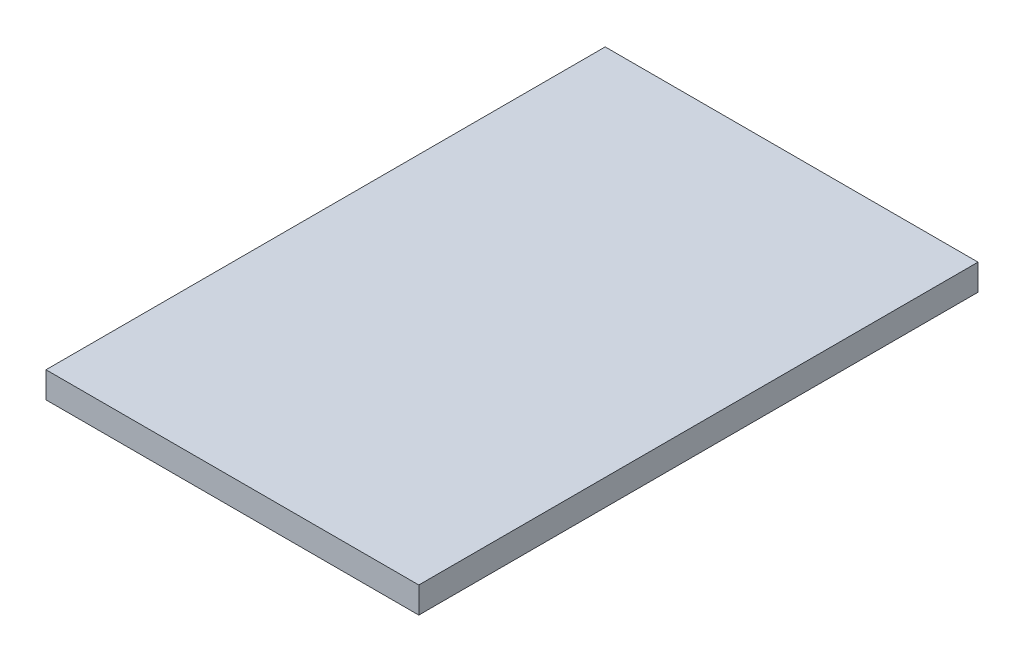
ISO-10303-21;
HEADER;
FILE_DESCRIPTION(('STEP AP214'),'2;1');
FILE_NAME('part.step','',(''),(''),'','','');
FILE_SCHEMA(('AUTOMOTIVE_DESIGN { 1 0 10303 214 1 1 1 1 }'));
ENDSEC;
DATA;
#1=APPLICATION_CONTEXT('core data for automotive mechanical design processes');
#2=APPLICATION_PROTOCOL_DEFINITION('international standard','automotive_design',2000,#1);
#3=PRODUCT_CONTEXT('',#1,'mechanical');
#4=PRODUCT('Part','Part','',(#3));
#5=PRODUCT_RELATED_PRODUCT_CATEGORY('part','',(#4));
#6=PRODUCT_DEFINITION_FORMATION('','',#4);
#7=PRODUCT_DEFINITION_CONTEXT('part definition',#1,'design');
#8=PRODUCT_DEFINITION('design','',#6,#7);
#9=PRODUCT_DEFINITION_SHAPE('','',#8);
#10=(LENGTH_UNIT() NAMED_UNIT(*) SI_UNIT(.MILLI.,.METRE.));
#11=(NAMED_UNIT(*) PLANE_ANGLE_UNIT() SI_UNIT($,.RADIAN.));
#12=(NAMED_UNIT(*) SI_UNIT($,.STERADIAN.) SOLID_ANGLE_UNIT());
#13=UNCERTAINTY_MEASURE_WITH_UNIT(LENGTH_MEASURE(1.E-05),#10,'distance_accuracy_value','');
#14=(GEOMETRIC_REPRESENTATION_CONTEXT(3) GLOBAL_UNCERTAINTY_ASSIGNED_CONTEXT((#13)) GLOBAL_UNIT_ASSIGNED_CONTEXT((#10,
#11,#12)) REPRESENTATION_CONTEXT('',''));
#15=CARTESIAN_POINT('',(0.,0.,0.));
#16=DIRECTION('',(0.,0.,1.));
#17=DIRECTION('',(1.,0.,0.));
#18=AXIS2_PLACEMENT_3D('',#15,#16,#17);
#19=CARTESIAN_POINT('',(10.,0.,7.5));
#20=DIRECTION('',(0.,0.,1.));
#21=DIRECTION('',(1.,0.,0.));
#22=AXIS2_PLACEMENT_3D('',#19,#20,#21);
#23=PLANE('',#22);
#24=DIRECTION('',(-1.,0.,0.));
#25=VECTOR('',#24,1.);
#26=CARTESIAN_POINT('',(10.,-0.7,7.5));
#27=LINE('',#26,#25);
#28=CARTESIAN_POINT('',(10.,-0.7,7.5));
#29=VERTEX_POINT('',#28);
#30=CARTESIAN_POINT('',(0.,-0.7,7.5));
#31=VERTEX_POINT('',#30);
#32=EDGE_CURVE('E97',#29,#31,#27,.T.);
#33=ORIENTED_EDGE('',*,*,#32,.F.);
#34=DIRECTION('',(0.,-1.,0.));
#35=VECTOR('',#34,1.);
#36=CARTESIAN_POINT('',(10.,0.,7.5));
#37=LINE('',#36,#35);
#38=CARTESIAN_POINT('',(10.,0.,7.5));
#39=VERTEX_POINT('',#38);
#40=EDGE_CURVE('E11',#39,#29,#37,.T.);
#41=ORIENTED_EDGE('',*,*,#40,.F.);
#42=DIRECTION('',(-1.,0.,0.));
#43=VECTOR('',#42,1.);
#44=CARTESIAN_POINT('',(10.,0.,7.5));
#45=LINE('',#44,#43);
#46=CARTESIAN_POINT('',(0.,0.,7.5));
#47=VERTEX_POINT('',#46);
#48=EDGE_CURVE('E91',#39,#47,#45,.T.);
#49=ORIENTED_EDGE('',*,*,#48,.T.);
#50=DIRECTION('',(0.,-1.,0.));
#51=VECTOR('',#50,1.);
#52=CARTESIAN_POINT('',(0.,0.,7.5));
#53=LINE('',#52,#51);
#54=EDGE_CURVE('E36',#47,#31,#53,.T.);
#55=ORIENTED_EDGE('',*,*,#54,.T.);
#56=EDGE_LOOP('',(#33,#41,#49,#55));
#57=FACE_BOUND('',#56,.T.);
#58=ADVANCED_FACE('F33',(#57),#23,.T.);
#59=CARTESIAN_POINT('',(10.,0.,-7.5));
#60=DIRECTION('',(1.,0.,0.));
#61=DIRECTION('',(0.,0.,-1.));
#62=AXIS2_PLACEMENT_3D('',#59,#60,#61);
#63=PLANE('',#62);
#64=DIRECTION('',(0.,0.,1.));
#65=VECTOR('',#64,1.);
#66=CARTESIAN_POINT('',(10.,-0.7,-7.5));
#67=LINE('',#66,#65);
#68=CARTESIAN_POINT('',(10.,-0.7,-7.5));
#69=VERTEX_POINT('',#68);
#70=EDGE_CURVE('E93',#69,#29,#67,.T.);
#71=ORIENTED_EDGE('',*,*,#70,.F.);
#72=DIRECTION('',(0.,-1.,0.));
#73=VECTOR('',#72,1.);
#74=CARTESIAN_POINT('',(10.,0.,-7.5));
#75=LINE('',#74,#73);
#76=CARTESIAN_POINT('',(10.,0.,-7.5));
#77=VERTEX_POINT('',#76);
#78=EDGE_CURVE('E42',#77,#69,#75,.T.);
#79=ORIENTED_EDGE('',*,*,#78,.F.);
#80=DIRECTION('',(0.,0.,1.));
#81=VECTOR('',#80,1.);
#82=CARTESIAN_POINT('',(10.,0.,-7.5));
#83=LINE('',#82,#81);
#84=EDGE_CURVE('E88',#77,#39,#83,.T.);
#85=ORIENTED_EDGE('',*,*,#84,.T.);
#86=ORIENTED_EDGE('',*,*,#40,.T.);
#87=EDGE_LOOP('',(#71,#79,#85,#86));
#88=FACE_BOUND('',#87,.T.);
#89=ADVANCED_FACE('F107',(#88),#63,.T.);
#90=CARTESIAN_POINT('',(0.,0.,-7.5));
#91=DIRECTION('',(0.,0.,-1.));
#92=DIRECTION('',(-1.,0.,0.));
#93=AXIS2_PLACEMENT_3D('',#90,#91,#92);
#94=PLANE('',#93);
#95=DIRECTION('',(1.,0.,0.));
#96=VECTOR('',#95,1.);
#97=CARTESIAN_POINT('',(0.,-0.7,-7.5));
#98=LINE('',#97,#96);
#99=CARTESIAN_POINT('',(0.,-0.7,-7.5));
#100=VERTEX_POINT('',#99);
#101=EDGE_CURVE('E83',#100,#69,#98,.T.);
#102=ORIENTED_EDGE('',*,*,#101,.F.);
#103=DIRECTION('',(0.,-1.,0.));
#104=VECTOR('',#103,1.);
#105=CARTESIAN_POINT('',(0.,0.,-7.5));
#106=LINE('',#105,#104);
#107=CARTESIAN_POINT('',(0.,0.,-7.5));
#108=VERTEX_POINT('',#107);
#109=EDGE_CURVE('E78',#108,#100,#106,.T.);
#110=ORIENTED_EDGE('',*,*,#109,.F.);
#111=DIRECTION('',(1.,0.,0.));
#112=VECTOR('',#111,1.);
#113=CARTESIAN_POINT('',(0.,0.,-7.5));
#114=LINE('',#113,#112);
#115=EDGE_CURVE('E81',#108,#77,#114,.T.);
#116=ORIENTED_EDGE('',*,*,#115,.T.);
#117=ORIENTED_EDGE('',*,*,#78,.T.);
#118=EDGE_LOOP('',(#102,#110,#116,#117));
#119=FACE_BOUND('',#118,.T.);
#120=ADVANCED_FACE('F80',(#119),#94,.T.);
#121=CARTESIAN_POINT('',(0.,0.,7.5));
#122=DIRECTION('',(-1.,0.,0.));
#123=DIRECTION('',(0.,0.,1.));
#124=AXIS2_PLACEMENT_3D('',#121,#122,#123);
#125=PLANE('',#124);
#126=DIRECTION('',(0.,0.,-1.));
#127=VECTOR('',#126,1.);
#128=CARTESIAN_POINT('',(0.,-0.7,7.5));
#129=LINE('',#128,#127);
#130=EDGE_CURVE('E100',#31,#100,#129,.T.);
#131=ORIENTED_EDGE('',*,*,#130,.F.);
#132=ORIENTED_EDGE('',*,*,#54,.F.);
#133=DIRECTION('',(0.,0.,-1.));
#134=VECTOR('',#133,1.);
#135=CARTESIAN_POINT('',(0.,0.,7.5));
#136=LINE('',#135,#134);
#137=EDGE_CURVE('E87',#47,#108,#136,.T.);
#138=ORIENTED_EDGE('',*,*,#137,.T.);
#139=ORIENTED_EDGE('',*,*,#109,.T.);
#140=EDGE_LOOP('',(#131,#132,#138,#139));
#141=FACE_BOUND('',#140,.T.);
#142=ADVANCED_FACE('F90',(#141),#125,.T.);
#143=CARTESIAN_POINT('',(0.,0.,0.));
#144=DIRECTION('',(0.,-1.,0.));
#145=DIRECTION('',(0.,0.,-1.));
#146=AXIS2_PLACEMENT_3D('',#143,#144,#145);
#147=PLANE('',#146);
#148=ORIENTED_EDGE('',*,*,#48,.F.);
#149=ORIENTED_EDGE('',*,*,#84,.F.);
#150=ORIENTED_EDGE('',*,*,#115,.F.);
#151=ORIENTED_EDGE('',*,*,#137,.F.);
#152=EDGE_LOOP('',(#148,#149,#150,#151));
#153=FACE_BOUND('',#152,.T.);
#154=ADVANCED_FACE('F86',(#153),#147,.F.);
#155=CARTESIAN_POINT('',(0.,-0.7,0.));
#156=DIRECTION('',(0.,-1.,0.));
#157=DIRECTION('',(0.,0.,-1.));
#158=AXIS2_PLACEMENT_3D('',#155,#156,#157);
#159=PLANE('',#158);
#160=ORIENTED_EDGE('',*,*,#32,.T.);
#161=ORIENTED_EDGE('',*,*,#130,.T.);
#162=ORIENTED_EDGE('',*,*,#101,.T.);
#163=ORIENTED_EDGE('',*,*,#70,.T.);
#164=EDGE_LOOP('',(#160,#161,#162,#163));
#165=FACE_BOUND('',#164,.T.);
#166=ADVANCED_FACE('F106',(#165),#159,.T.);
#167=CLOSED_SHELL('',(#58,#89,#120,#142,#154,#166));
#168=MANIFOLD_SOLID_BREP('B2',#167);
#169=ADVANCED_BREP_SHAPE_REPRESENTATION('',(#18,#168),#14);
#170=SHAPE_DEFINITION_REPRESENTATION(#9,#169);
ENDSEC;
END-ISO-10303-21;
